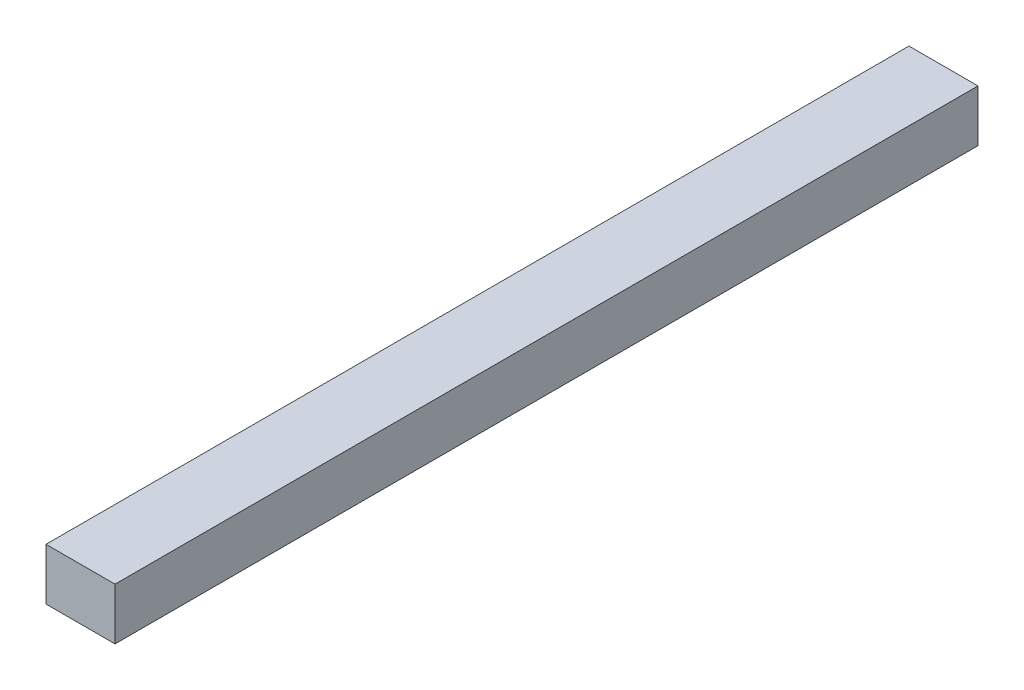
ISO-10303-21;
HEADER;
FILE_DESCRIPTION(('STEP AP214'),'2;1');
FILE_NAME('part.step','',(''),(''),'','','');
FILE_SCHEMA(('AUTOMOTIVE_DESIGN { 1 0 10303 214 1 1 1 1 }'));
ENDSEC;
DATA;
#1=APPLICATION_CONTEXT('core data for automotive mechanical design processes');
#2=APPLICATION_PROTOCOL_DEFINITION('international standard','automotive_design',2000,#1);
#3=PRODUCT_CONTEXT('',#1,'mechanical');
#4=PRODUCT('Part','Part','',(#3));
#5=PRODUCT_RELATED_PRODUCT_CATEGORY('part','',(#4));
#6=PRODUCT_DEFINITION_FORMATION('','',#4);
#7=PRODUCT_DEFINITION_CONTEXT('part definition',#1,'design');
#8=PRODUCT_DEFINITION('design','',#6,#7);
#9=PRODUCT_DEFINITION_SHAPE('','',#8);
#10=(LENGTH_UNIT() NAMED_UNIT(*) SI_UNIT(.MILLI.,.METRE.));
#11=(NAMED_UNIT(*) PLANE_ANGLE_UNIT() SI_UNIT($,.RADIAN.));
#12=(NAMED_UNIT(*) SI_UNIT($,.STERADIAN.) SOLID_ANGLE_UNIT());
#13=UNCERTAINTY_MEASURE_WITH_UNIT(LENGTH_MEASURE(1.E-05),#10,'distance_accuracy_value','');
#14=(GEOMETRIC_REPRESENTATION_CONTEXT(3) GLOBAL_UNCERTAINTY_ASSIGNED_CONTEXT((#13)) GLOBAL_UNIT_ASSIGNED_CONTEXT((#10,
#11,#12)) REPRESENTATION_CONTEXT('',''));
#15=CARTESIAN_POINT('',(0.,0.,0.));
#16=DIRECTION('',(0.,0.,1.));
#17=DIRECTION('',(1.,0.,0.));
#18=AXIS2_PLACEMENT_3D('',#15,#16,#17);
#19=CARTESIAN_POINT('',(200.,150.,2500.));
#20=DIRECTION('',(-1.,0.,0.));
#21=DIRECTION('',(0.,0.,1.));
#22=AXIS2_PLACEMENT_3D('',#19,#20,#21);
#23=PLANE('',#22);
#24=DIRECTION('',(0.,1.,0.));
#25=VECTOR('',#24,1.);
#26=CARTESIAN_POINT('',(200.,150.,-2500.));
#27=LINE('',#26,#25);
#28=CARTESIAN_POINT('',(200.,-150.,-2500.));
#29=VERTEX_POINT('',#28);
#30=CARTESIAN_POINT('',(200.,150.,-2500.));
#31=VERTEX_POINT('',#30);
#32=EDGE_CURVE('E96',#29,#31,#27,.T.);
#33=ORIENTED_EDGE('',*,*,#32,.T.);
#34=DIRECTION('',(0.,0.,-1.));
#35=VECTOR('',#34,1.);
#36=CARTESIAN_POINT('',(200.,150.,2500.));
#37=LINE('',#36,#35);
#38=CARTESIAN_POINT('',(200.,150.,2500.));
#39=VERTEX_POINT('',#38);
#40=EDGE_CURVE('E11',#39,#31,#37,.T.);
#41=ORIENTED_EDGE('',*,*,#40,.F.);
#42=DIRECTION('',(0.,1.,0.));
#43=VECTOR('',#42,1.);
#44=CARTESIAN_POINT('',(200.,150.,2500.));
#45=LINE('',#44,#43);
#46=CARTESIAN_POINT('',(200.,-150.,2500.));
#47=VERTEX_POINT('',#46);
#48=EDGE_CURVE('E84',#47,#39,#45,.T.);
#49=ORIENTED_EDGE('',*,*,#48,.F.);
#50=DIRECTION('',(0.,0.,-1.));
#51=VECTOR('',#50,1.);
#52=CARTESIAN_POINT('',(200.,-150.,2500.));
#53=LINE('',#52,#51);
#54=EDGE_CURVE('E92',#47,#29,#53,.T.);
#55=ORIENTED_EDGE('',*,*,#54,.T.);
#56=EDGE_LOOP('',(#33,#41,#49,#55));
#57=FACE_BOUND('',#56,.T.);
#58=ADVANCED_FACE('F33',(#57),#23,.F.);
#59=CARTESIAN_POINT('',(-200.,150.,2500.));
#60=DIRECTION('',(0.,-1.,0.));
#61=DIRECTION('',(0.,0.,-1.));
#62=AXIS2_PLACEMENT_3D('',#59,#60,#61);
#63=PLANE('',#62);
#64=DIRECTION('',(-1.,0.,0.));
#65=VECTOR('',#64,1.);
#66=CARTESIAN_POINT('',(-200.,150.,-2500.));
#67=LINE('',#66,#65);
#68=CARTESIAN_POINT('',(-200.,150.,-2500.));
#69=VERTEX_POINT('',#68);
#70=EDGE_CURVE('E88',#31,#69,#67,.T.);
#71=ORIENTED_EDGE('',*,*,#70,.T.);
#72=DIRECTION('',(0.,0.,-1.));
#73=VECTOR('',#72,1.);
#74=CARTESIAN_POINT('',(-200.,150.,2500.));
#75=LINE('',#74,#73);
#76=CARTESIAN_POINT('',(-200.,150.,2500.));
#77=VERTEX_POINT('',#76);
#78=EDGE_CURVE('E41',#77,#69,#75,.T.);
#79=ORIENTED_EDGE('',*,*,#78,.F.);
#80=DIRECTION('',(-1.,0.,0.));
#81=VECTOR('',#80,1.);
#82=CARTESIAN_POINT('',(-200.,150.,2500.));
#83=LINE('',#82,#81);
#84=EDGE_CURVE('E79',#39,#77,#83,.T.);
#85=ORIENTED_EDGE('',*,*,#84,.F.);
#86=ORIENTED_EDGE('',*,*,#40,.T.);
#87=EDGE_LOOP('',(#71,#79,#85,#86));
#88=FACE_BOUND('',#87,.T.);
#89=ADVANCED_FACE('F87',(#88),#63,.F.);
#90=CARTESIAN_POINT('',(-200.,150.,2500.));
#91=DIRECTION('',(1.,0.,0.));
#92=DIRECTION('',(0.,1.,0.));
#93=AXIS2_PLACEMENT_3D('',#90,#91,#92);
#94=PLANE('',#93);
#95=DIRECTION('',(0.,-1.,0.));
#96=VECTOR('',#95,1.);
#97=CARTESIAN_POINT('',(-200.,150.,-2500.));
#98=LINE('',#97,#96);
#99=CARTESIAN_POINT('',(-200.,-150.,-2500.));
#100=VERTEX_POINT('',#99);
#101=EDGE_CURVE('E66',#69,#100,#98,.T.);
#102=ORIENTED_EDGE('',*,*,#101,.T.);
#103=DIRECTION('',(0.,0.,-1.));
#104=VECTOR('',#103,1.);
#105=CARTESIAN_POINT('',(-200.,-150.,2500.));
#106=LINE('',#105,#104);
#107=CARTESIAN_POINT('',(-200.,-150.,2500.));
#108=VERTEX_POINT('',#107);
#109=EDGE_CURVE('E89',#108,#100,#106,.T.);
#110=ORIENTED_EDGE('',*,*,#109,.F.);
#111=DIRECTION('',(0.,-1.,0.));
#112=VECTOR('',#111,1.);
#113=CARTESIAN_POINT('',(-200.,150.,2500.));
#114=LINE('',#113,#112);
#115=EDGE_CURVE('E82',#77,#108,#114,.T.);
#116=ORIENTED_EDGE('',*,*,#115,.F.);
#117=ORIENTED_EDGE('',*,*,#78,.T.);
#118=EDGE_LOOP('',(#102,#110,#116,#117));
#119=FACE_BOUND('',#118,.T.);
#120=ADVANCED_FACE('F90',(#119),#94,.F.);
#121=CARTESIAN_POINT('',(-200.,-150.,2500.));
#122=DIRECTION('',(0.,1.,0.));
#123=DIRECTION('',(0.,0.,1.));
#124=AXIS2_PLACEMENT_3D('',#121,#122,#123);
#125=PLANE('',#124);
#126=DIRECTION('',(1.,0.,0.));
#127=VECTOR('',#126,1.);
#128=CARTESIAN_POINT('',(-200.,-150.,-2500.));
#129=LINE('',#128,#127);
#130=EDGE_CURVE('E72',#100,#29,#129,.T.);
#131=ORIENTED_EDGE('',*,*,#130,.T.);
#132=ORIENTED_EDGE('',*,*,#54,.F.);
#133=DIRECTION('',(1.,0.,0.));
#134=VECTOR('',#133,1.);
#135=CARTESIAN_POINT('',(-200.,-150.,2500.));
#136=LINE('',#135,#134);
#137=EDGE_CURVE('E49',#108,#47,#136,.T.);
#138=ORIENTED_EDGE('',*,*,#137,.F.);
#139=ORIENTED_EDGE('',*,*,#109,.T.);
#140=EDGE_LOOP('',(#131,#132,#138,#139));
#141=FACE_BOUND('',#140,.T.);
#142=ADVANCED_FACE('F103',(#141),#125,.F.);
#143=CARTESIAN_POINT('',(0.,0.,2500.));
#144=DIRECTION('',(0.,0.,1.));
#145=DIRECTION('',(1.,0.,0.));
#146=AXIS2_PLACEMENT_3D('',#143,#144,#145);
#147=PLANE('',#146);
#148=ORIENTED_EDGE('',*,*,#48,.T.);
#149=ORIENTED_EDGE('',*,*,#84,.T.);
#150=ORIENTED_EDGE('',*,*,#115,.T.);
#151=ORIENTED_EDGE('',*,*,#137,.T.);
#152=EDGE_LOOP('',(#148,#149,#150,#151));
#153=FACE_BOUND('',#152,.T.);
#154=ADVANCED_FACE('F80',(#153),#147,.T.);
#155=CARTESIAN_POINT('',(0.,0.,-2500.));
#156=DIRECTION('',(0.,0.,1.));
#157=DIRECTION('',(1.,0.,0.));
#158=AXIS2_PLACEMENT_3D('',#155,#156,#157);
#159=PLANE('',#158);
#160=ORIENTED_EDGE('',*,*,#32,.F.);
#161=ORIENTED_EDGE('',*,*,#130,.F.);
#162=ORIENTED_EDGE('',*,*,#101,.F.);
#163=ORIENTED_EDGE('',*,*,#70,.F.);
#164=EDGE_LOOP('',(#160,#161,#162,#163));
#165=FACE_BOUND('',#164,.T.);
#166=ADVANCED_FACE('F106',(#165),#159,.F.);
#167=CLOSED_SHELL('',(#58,#89,#120,#142,#154,#166));
#168=MANIFOLD_SOLID_BREP('B2',#167);
#169=ADVANCED_BREP_SHAPE_REPRESENTATION('',(#18,#168),#14);
#170=SHAPE_DEFINITION_REPRESENTATION(#9,#169);
ENDSEC;
END-ISO-10303-21;
